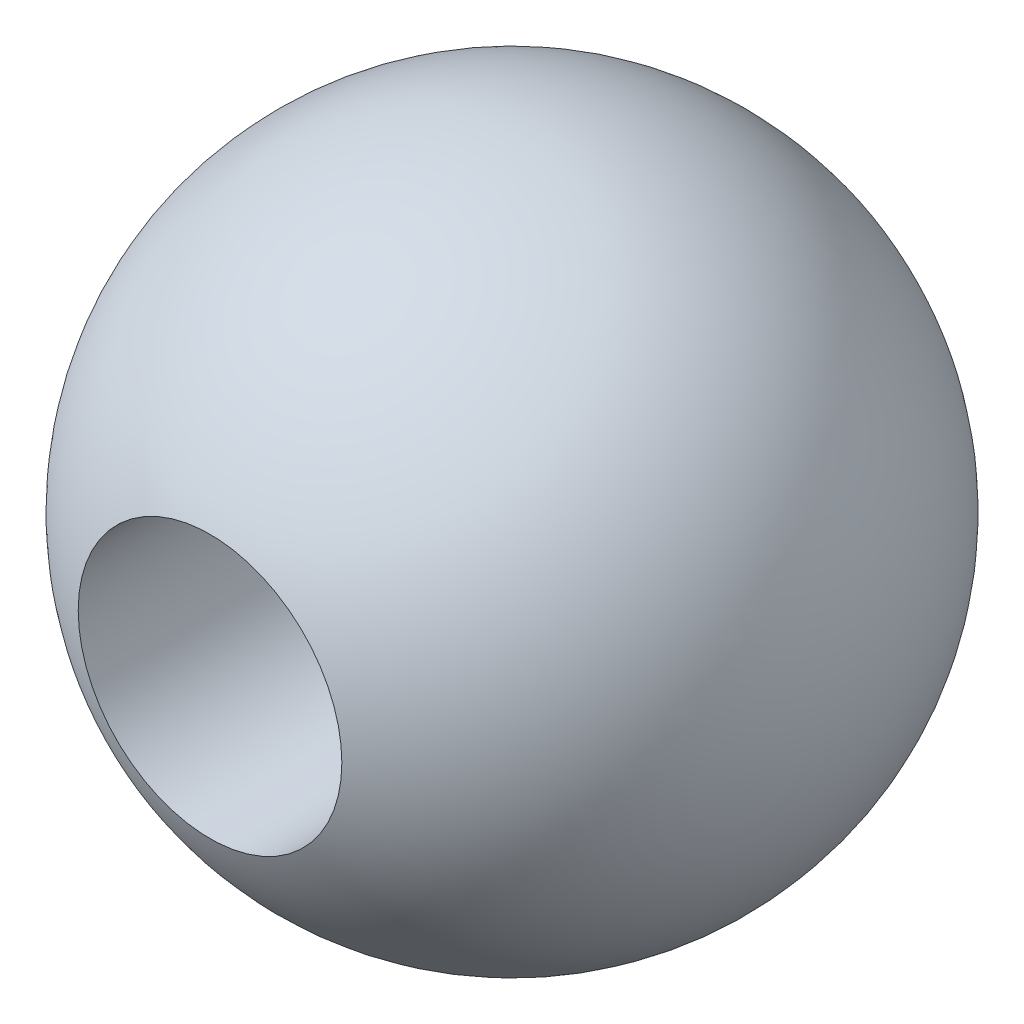
ISO-10303-21;
HEADER;
FILE_DESCRIPTION(('STEP AP214'),'2;1');
FILE_NAME('part.step','',(''),(''),'','','');
FILE_SCHEMA(('AUTOMOTIVE_DESIGN { 1 0 10303 214 1 1 1 1 }'));
ENDSEC;
DATA;
#1=APPLICATION_CONTEXT('core data for automotive mechanical design processes');
#2=APPLICATION_PROTOCOL_DEFINITION('international standard','automotive_design',2000,#1);
#3=PRODUCT_CONTEXT('',#1,'mechanical');
#4=PRODUCT('Part','Part','',(#3));
#5=PRODUCT_RELATED_PRODUCT_CATEGORY('part','',(#4));
#6=PRODUCT_DEFINITION_FORMATION('','',#4);
#7=PRODUCT_DEFINITION_CONTEXT('part definition',#1,'design');
#8=PRODUCT_DEFINITION('design','',#6,#7);
#9=PRODUCT_DEFINITION_SHAPE('','',#8);
#10=(LENGTH_UNIT() NAMED_UNIT(*) SI_UNIT(.MILLI.,.METRE.));
#11=(NAMED_UNIT(*) PLANE_ANGLE_UNIT() SI_UNIT($,.RADIAN.));
#12=(NAMED_UNIT(*) SI_UNIT($,.STERADIAN.) SOLID_ANGLE_UNIT());
#13=UNCERTAINTY_MEASURE_WITH_UNIT(LENGTH_MEASURE(1.E-05),#10,'distance_accuracy_value','');
#14=(GEOMETRIC_REPRESENTATION_CONTEXT(3) GLOBAL_UNCERTAINTY_ASSIGNED_CONTEXT((#13)) GLOBAL_UNIT_ASSIGNED_CONTEXT((#10,
#11,#12)) REPRESENTATION_CONTEXT('',''));
#15=CARTESIAN_POINT('',(0.,0.,0.));
#16=DIRECTION('',(0.,0.,1.));
#17=DIRECTION('',(1.,0.,0.));
#18=AXIS2_PLACEMENT_3D('',#15,#16,#17);
#19=CARTESIAN_POINT('',(0.,0.,0.));
#20=DIRECTION('',(0.,0.,1.));
#21=DIRECTION('',(-1.,0.,0.));
#22=AXIS2_PLACEMENT_3D('',#19,#20,#21);
#23=SPHERICAL_SURFACE('',#22,5.);
#24=CARTESIAN_POINT('',(0.,0.,4.58257569495584));
#25=DIRECTION('',(0.,0.,-1.));
#26=DIRECTION('',(-1.,0.,0.));
#27=AXIS2_PLACEMENT_3D('',#24,#25,#26);
#28=CIRCLE('',#27,2.);
#29=CARTESIAN_POINT('',(-2.,0.,4.58257569495584));
#30=VERTEX_POINT('',#29);
#31=EDGE_CURVE('E10',#30,#30,#28,.T.);
#32=ORIENTED_EDGE('',*,*,#31,.T.);
#33=EDGE_LOOP('',(#32));
#34=FACE_BOUND('',#33,.T.);
#35=ADVANCED_FACE('F31',(#34),#23,.T.);
#36=CARTESIAN_POINT('',(0.,0.,0.));
#37=DIRECTION('',(0.,0.,1.));
#38=DIRECTION('',(1.,0.,0.));
#39=AXIS2_PLACEMENT_3D('',#36,#37,#38);
#40=CYLINDRICAL_SURFACE('',#39,2.);
#41=CARTESIAN_POINT('',(0.,0.,0.));
#42=DIRECTION('',(0.,0.,1.));
#43=DIRECTION('',(1.,0.,0.));
#44=AXIS2_PLACEMENT_3D('',#41,#42,#43);
#45=CIRCLE('',#44,2.);
#46=CARTESIAN_POINT('',(2.,0.,0.));
#47=VERTEX_POINT('',#46);
#48=EDGE_CURVE('E37',#47,#47,#45,.T.);
#49=ORIENTED_EDGE('',*,*,#48,.F.);
#50=EDGE_LOOP('',(#49));
#51=FACE_BOUND('',#50,.T.);
#52=ORIENTED_EDGE('',*,*,#31,.F.);
#53=EDGE_LOOP('',(#52));
#54=FACE_BOUND('',#53,.T.);
#55=ADVANCED_FACE('F45',(#51,#54),#40,.F.);
#56=CARTESIAN_POINT('',(0.,0.,0.));
#57=DIRECTION('',(0.,0.,1.));
#58=DIRECTION('',(1.,0.,0.));
#59=AXIS2_PLACEMENT_3D('',#56,#57,#58);
#60=PLANE('',#59);
#61=ORIENTED_EDGE('',*,*,#48,.T.);
#62=EDGE_LOOP('',(#61));
#63=FACE_BOUND('',#62,.T.);
#64=ADVANCED_FACE('F43',(#63),#60,.T.);
#65=CLOSED_SHELL('',(#35,#55,#64));
#66=MANIFOLD_SOLID_BREP('B2',#65);
#67=ADVANCED_BREP_SHAPE_REPRESENTATION('',(#18,#66),#14);
#68=SHAPE_DEFINITION_REPRESENTATION(#9,#67);
ENDSEC;
END-ISO-10303-21;
